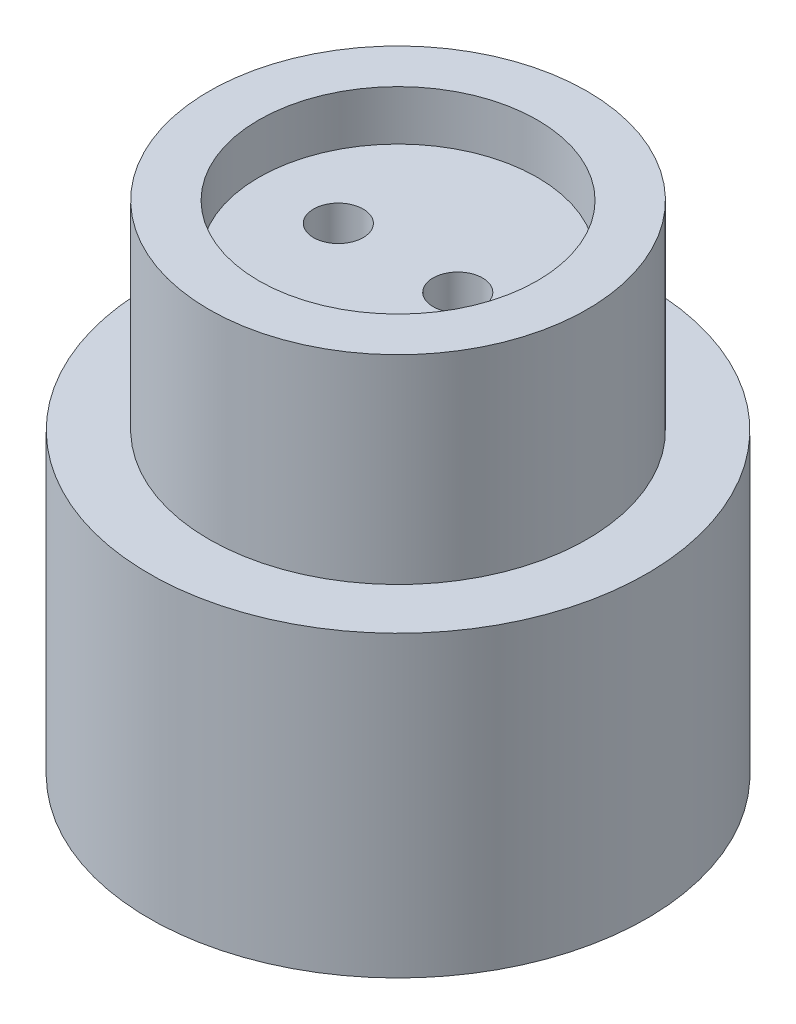
ISO-10303-21;
HEADER;
FILE_DESCRIPTION(('STEP AP214'),'2;1');
FILE_NAME('part.step','',(''),(''),'','','');
FILE_SCHEMA(('AUTOMOTIVE_DESIGN { 1 0 10303 214 1 1 1 1 }'));
ENDSEC;
DATA;
#1=APPLICATION_CONTEXT('core data for automotive mechanical design processes');
#2=APPLICATION_PROTOCOL_DEFINITION('international standard','automotive_design',2000,#1);
#3=PRODUCT_CONTEXT('',#1,'mechanical');
#4=PRODUCT('Part','Part','',(#3));
#5=PRODUCT_RELATED_PRODUCT_CATEGORY('part','',(#4));
#6=PRODUCT_DEFINITION_FORMATION('','',#4);
#7=PRODUCT_DEFINITION_CONTEXT('part definition',#1,'design');
#8=PRODUCT_DEFINITION('design','',#6,#7);
#9=PRODUCT_DEFINITION_SHAPE('','',#8);
#10=(LENGTH_UNIT() NAMED_UNIT(*) SI_UNIT(.MILLI.,.METRE.));
#11=(NAMED_UNIT(*) PLANE_ANGLE_UNIT() SI_UNIT($,.RADIAN.));
#12=(NAMED_UNIT(*) SI_UNIT($,.STERADIAN.) SOLID_ANGLE_UNIT());
#13=UNCERTAINTY_MEASURE_WITH_UNIT(LENGTH_MEASURE(1.E-05),#10,'distance_accuracy_value','');
#14=(GEOMETRIC_REPRESENTATION_CONTEXT(3) GLOBAL_UNCERTAINTY_ASSIGNED_CONTEXT((#13)) GLOBAL_UNIT_ASSIGNED_CONTEXT((#10,
#11,#12)) REPRESENTATION_CONTEXT('',''));
#15=CARTESIAN_POINT('',(0.,0.,0.));
#16=DIRECTION('',(0.,0.,1.));
#17=DIRECTION('',(1.,0.,0.));
#18=AXIS2_PLACEMENT_3D('',#15,#16,#17);
#19=CARTESIAN_POINT('',(1.3,2.64854185998995,0.));
#20=DIRECTION('',(0.,-1.,0.));
#21=DIRECTION('',(1.,0.,0.));
#22=AXIS2_PLACEMENT_3D('',#19,#20,#21);
#23=CYLINDRICAL_SURFACE('',#22,0.249337209086342);
#24=CARTESIAN_POINT('',(1.3,2.,0.));
#25=DIRECTION('',(0.707106781186548,-0.707106781186547,0.));
#26=DIRECTION('',(0.707106781186547,0.707106781186548,0.));
#27=AXIS2_PLACEMENT_3D('',#24,#25,#26);
#28=ELLIPSE('',#27,0.352616062694161,0.249337209086342);
#29=CARTESIAN_POINT('',(1.54933720908634,2.24933720908634,0.));
#30=VERTEX_POINT('',#29);
#31=EDGE_CURVE('E90',#30,#30,#28,.F.);
#32=ORIENTED_EDGE('',*,*,#31,.T.);
#33=EDGE_LOOP('',(#32));
#34=FACE_BOUND('',#33,.T.);
#35=CARTESIAN_POINT('',(1.3,0.,0.));
#36=DIRECTION('',(0.,-1.,0.));
#37=DIRECTION('',(0.,0.,-1.));
#38=AXIS2_PLACEMENT_3D('',#35,#36,#37);
#39=CIRCLE('',#38,0.249337209086342);
#40=CARTESIAN_POINT('',(1.3,0.,-0.249337209086342));
#41=VERTEX_POINT('',#40);
#42=EDGE_CURVE('E48',#41,#41,#39,.T.);
#43=ORIENTED_EDGE('',*,*,#42,.T.);
#44=EDGE_LOOP('',(#43));
#45=FACE_BOUND('',#44,.T.);
#46=ADVANCED_FACE('F32',(#34,#45),#23,.F.);
#47=CARTESIAN_POINT('',(-0.0485418599899526,2.,0.));
#48=DIRECTION('',(1.,0.,0.));
#49=DIRECTION('',(0.,0.,-1.));
#50=AXIS2_PLACEMENT_3D('',#47,#48,#49);
#51=CYLINDRICAL_SURFACE('',#50,0.249337209086342);
#52=CARTESIAN_POINT('',(0.6,2.,0.));
#53=DIRECTION('',(0.707106781186548,-0.707106781186547,0.));
#54=DIRECTION('',(-0.707106781186547,-0.707106781186548,0.));
#55=AXIS2_PLACEMENT_3D('',#52,#53,#54);
#56=ELLIPSE('',#55,0.352616062694161,0.249337209086342);
#57=CARTESIAN_POINT('',(0.350662790913658,1.75066279091366,0.));
#58=VERTEX_POINT('',#57);
#59=EDGE_CURVE('E85',#58,#58,#56,.F.);
#60=ORIENTED_EDGE('',*,*,#59,.T.);
#61=EDGE_LOOP('',(#60));
#62=FACE_BOUND('',#61,.T.);
#63=ORIENTED_EDGE('',*,*,#31,.F.);
#64=EDGE_LOOP('',(#63));
#65=FACE_BOUND('',#64,.T.);
#66=ADVANCED_FACE('F136',(#62,#65),#51,.F.);
#67=CARTESIAN_POINT('',(0.6,4.5,0.));
#68=DIRECTION('',(0.,-1.,0.));
#69=DIRECTION('',(1.,0.,0.));
#70=AXIS2_PLACEMENT_3D('',#67,#68,#69);
#71=CYLINDRICAL_SURFACE('',#70,0.249337209086342);
#72=ORIENTED_EDGE('',*,*,#59,.F.);
#73=EDGE_LOOP('',(#72));
#74=FACE_BOUND('',#73,.T.);
#75=CARTESIAN_POINT('',(0.6,4.5,0.));
#76=DIRECTION('',(0.,1.,0.));
#77=DIRECTION('',(0.,0.,1.));
#78=AXIS2_PLACEMENT_3D('',#75,#76,#77);
#79=CIRCLE('',#78,0.249337209086342);
#80=CARTESIAN_POINT('',(0.6,4.5,0.249337209086342));
#81=VERTEX_POINT('',#80);
#82=EDGE_CURVE('E52',#81,#81,#79,.T.);
#83=ORIENTED_EDGE('',*,*,#82,.T.);
#84=EDGE_LOOP('',(#83));
#85=FACE_BOUND('',#84,.T.);
#86=ADVANCED_FACE('F142',(#74,#85),#71,.F.);
#87=CARTESIAN_POINT('',(0.,0.,0.));
#88=DIRECTION('',(0.,-1.,0.));
#89=DIRECTION('',(0.,0.,-1.));
#90=AXIS2_PLACEMENT_3D('',#87,#88,#89);
#91=PLANE('',#90);
#92=CARTESIAN_POINT('',(-1.3,0.,0.));
#93=DIRECTION('',(0.,-1.,0.));
#94=DIRECTION('',(0.,0.,-1.));
#95=AXIS2_PLACEMENT_3D('',#92,#93,#94);
#96=CIRCLE('',#95,0.249337209086342);
#97=CARTESIAN_POINT('',(-1.3,0.,-0.249337209086342));
#98=VERTEX_POINT('',#97);
#99=EDGE_CURVE('E36',#98,#98,#96,.F.);
#100=ORIENTED_EDGE('',*,*,#99,.T.);
#101=EDGE_LOOP('',(#100));
#102=FACE_BOUND('',#101,.T.);
#103=ORIENTED_EDGE('',*,*,#42,.F.);
#104=EDGE_LOOP('',(#103));
#105=FACE_BOUND('',#104,.T.);
#106=CARTESIAN_POINT('',(0.,0.,0.));
#107=DIRECTION('',(0.,-1.,0.));
#108=DIRECTION('',(0.,0.,-1.));
#109=AXIS2_PLACEMENT_3D('',#106,#107,#108);
#110=CIRCLE('',#109,2.5);
#111=CARTESIAN_POINT('',(0.,0.,-2.5));
#112=VERTEX_POINT('',#111);
#113=EDGE_CURVE('E58',#112,#112,#110,.T.);
#114=ORIENTED_EDGE('',*,*,#113,.T.);
#115=EDGE_LOOP('',(#114));
#116=FACE_BOUND('',#115,.T.);
#117=ADVANCED_FACE('F34',(#102,#105,#116),#91,.T.);
#118=CARTESIAN_POINT('',(0.,0.,0.));
#119=DIRECTION('',(0.,-1.,0.));
#120=DIRECTION('',(0.,0.,-1.));
#121=AXIS2_PLACEMENT_3D('',#118,#119,#120);
#122=CYLINDRICAL_SURFACE('',#121,2.5);
#123=CARTESIAN_POINT('',(0.,3.,0.));
#124=DIRECTION('',(0.,-1.,0.));
#125=DIRECTION('',(0.,0.,-1.));
#126=AXIS2_PLACEMENT_3D('',#123,#124,#125);
#127=CIRCLE('',#126,2.5);
#128=CARTESIAN_POINT('',(0.,3.,-2.5));
#129=VERTEX_POINT('',#128);
#130=EDGE_CURVE('E61',#129,#129,#127,.T.);
#131=ORIENTED_EDGE('',*,*,#130,.T.);
#132=EDGE_LOOP('',(#131));
#133=FACE_BOUND('',#132,.T.);
#134=ORIENTED_EDGE('',*,*,#113,.F.);
#135=EDGE_LOOP('',(#134));
#136=FACE_BOUND('',#135,.T.);
#137=ADVANCED_FACE('F195',(#133,#136),#122,.T.);
#138=CARTESIAN_POINT('',(0.,3.,-2.5));
#139=DIRECTION('',(0.,1.,0.));
#140=DIRECTION('',(0.,0.,1.));
#141=AXIS2_PLACEMENT_3D('',#138,#139,#140);
#142=PLANE('',#141);
#143=CARTESIAN_POINT('',(0.,3.,0.));
#144=DIRECTION('',(0.,-1.,0.));
#145=DIRECTION('',(0.,0.,-1.));
#146=AXIS2_PLACEMENT_3D('',#143,#144,#145);
#147=CIRCLE('',#146,1.9);
#148=CARTESIAN_POINT('',(0.,3.,-1.9));
#149=VERTEX_POINT('',#148);
#150=EDGE_CURVE('E64',#149,#149,#147,.T.);
#151=ORIENTED_EDGE('',*,*,#150,.T.);
#152=EDGE_LOOP('',(#151));
#153=FACE_BOUND('',#152,.T.);
#154=ORIENTED_EDGE('',*,*,#130,.F.);
#155=EDGE_LOOP('',(#154));
#156=FACE_BOUND('',#155,.T.);
#157=ADVANCED_FACE('F192',(#153,#156),#142,.T.);
#158=CARTESIAN_POINT('',(0.,0.,0.));
#159=DIRECTION('',(0.,-1.,0.));
#160=DIRECTION('',(0.,0.,-1.));
#161=AXIS2_PLACEMENT_3D('',#158,#159,#160);
#162=CYLINDRICAL_SURFACE('',#161,1.9);
#163=CARTESIAN_POINT('',(0.,5.,0.));
#164=DIRECTION('',(0.,-1.,0.));
#165=DIRECTION('',(0.,0.,-1.));
#166=AXIS2_PLACEMENT_3D('',#163,#164,#165);
#167=CIRCLE('',#166,1.9);
#168=CARTESIAN_POINT('',(0.,5.,-1.9));
#169=VERTEX_POINT('',#168);
#170=EDGE_CURVE('E67',#169,#169,#167,.T.);
#171=ORIENTED_EDGE('',*,*,#170,.T.);
#172=EDGE_LOOP('',(#171));
#173=FACE_BOUND('',#172,.T.);
#174=ORIENTED_EDGE('',*,*,#150,.F.);
#175=EDGE_LOOP('',(#174));
#176=FACE_BOUND('',#175,.T.);
#177=ADVANCED_FACE('F188',(#173,#176),#162,.T.);
#178=CARTESIAN_POINT('',(0.,5.,-1.4));
#179=DIRECTION('',(0.,1.,0.));
#180=DIRECTION('',(0.,0.,1.));
#181=AXIS2_PLACEMENT_3D('',#178,#179,#180);
#182=PLANE('',#181);
#183=CARTESIAN_POINT('',(0.,5.,0.));
#184=DIRECTION('',(0.,-1.,0.));
#185=DIRECTION('',(0.,0.,-1.));
#186=AXIS2_PLACEMENT_3D('',#183,#184,#185);
#187=CIRCLE('',#186,1.4);
#188=CARTESIAN_POINT('',(0.,5.,-1.4));
#189=VERTEX_POINT('',#188);
#190=EDGE_CURVE('E70',#189,#189,#187,.T.);
#191=ORIENTED_EDGE('',*,*,#190,.T.);
#192=EDGE_LOOP('',(#191));
#193=FACE_BOUND('',#192,.T.);
#194=ORIENTED_EDGE('',*,*,#170,.F.);
#195=EDGE_LOOP('',(#194));
#196=FACE_BOUND('',#195,.T.);
#197=ADVANCED_FACE('F184',(#193,#196),#182,.T.);
#198=CARTESIAN_POINT('',(0.,0.,0.));
#199=DIRECTION('',(0.,-1.,0.));
#200=DIRECTION('',(0.,0.,-1.));
#201=AXIS2_PLACEMENT_3D('',#198,#199,#200);
#202=CYLINDRICAL_SURFACE('',#201,1.4);
#203=CARTESIAN_POINT('',(0.,4.5,0.));
#204=DIRECTION('',(0.,1.,0.));
#205=DIRECTION('',(0.,0.,1.));
#206=AXIS2_PLACEMENT_3D('',#203,#204,#205);
#207=CIRCLE('',#206,1.4);
#208=CARTESIAN_POINT('',(0.,4.5,1.4));
#209=VERTEX_POINT('',#208);
#210=EDGE_CURVE('E55',#209,#209,#207,.T.);
#211=ORIENTED_EDGE('',*,*,#210,.F.);
#212=EDGE_LOOP('',(#211));
#213=FACE_BOUND('',#212,.T.);
#214=ORIENTED_EDGE('',*,*,#190,.F.);
#215=EDGE_LOOP('',(#214));
#216=FACE_BOUND('',#215,.T.);
#217=ADVANCED_FACE('F170',(#213,#216),#202,.F.);
#218=CARTESIAN_POINT('',(0.,4.5,0.));
#219=DIRECTION('',(0.,1.,0.));
#220=DIRECTION('',(0.,0.,1.));
#221=AXIS2_PLACEMENT_3D('',#218,#219,#220);
#222=PLANE('',#221);
#223=CARTESIAN_POINT('',(-0.6,4.5,0.));
#224=DIRECTION('',(0.,-1.,0.));
#225=DIRECTION('',(0.,0.,1.));
#226=AXIS2_PLACEMENT_3D('',#223,#224,#225);
#227=CIRCLE('',#226,0.249337209086342);
#228=CARTESIAN_POINT('',(-0.6,4.5,0.249337209086342));
#229=VERTEX_POINT('',#228);
#230=EDGE_CURVE('E113',#229,#229,#227,.T.);
#231=ORIENTED_EDGE('',*,*,#230,.T.);
#232=EDGE_LOOP('',(#231));
#233=FACE_BOUND('',#232,.T.);
#234=ORIENTED_EDGE('',*,*,#210,.T.);
#235=EDGE_LOOP('',(#234));
#236=FACE_BOUND('',#235,.T.);
#237=ORIENTED_EDGE('',*,*,#82,.F.);
#238=EDGE_LOOP('',(#237));
#239=FACE_BOUND('',#238,.T.);
#240=ADVANCED_FACE('F167',(#233,#236,#239),#222,.T.);
#241=CARTESIAN_POINT('',(-0.6,4.5,0.));
#242=DIRECTION('',(0.,-1.,0.));
#243=DIRECTION('',(1.,0.,0.));
#244=AXIS2_PLACEMENT_3D('',#241,#242,#243);
#245=CYLINDRICAL_SURFACE('',#244,0.249337209086342);
#246=CARTESIAN_POINT('',(-0.6,2.,0.));
#247=DIRECTION('',(-0.707106781186548,-0.707106781186547,0.));
#248=DIRECTION('',(0.707106781186547,-0.707106781186548,0.));
#249=AXIS2_PLACEMENT_3D('',#246,#247,#248);
#250=ELLIPSE('',#249,0.352616062694161,0.249337209086342);
#251=CARTESIAN_POINT('',(-0.350662790913658,1.75066279091366,0.));
#252=VERTEX_POINT('',#251);
#253=EDGE_CURVE('E98',#252,#252,#250,.F.);
#254=ORIENTED_EDGE('',*,*,#253,.F.);
#255=EDGE_LOOP('',(#254));
#256=FACE_BOUND('',#255,.T.);
#257=ORIENTED_EDGE('',*,*,#230,.F.);
#258=EDGE_LOOP('',(#257));
#259=FACE_BOUND('',#258,.T.);
#260=ADVANCED_FACE('F131',(#256,#259),#245,.F.);
#261=CARTESIAN_POINT('',(0.0485418599899526,2.,0.));
#262=DIRECTION('',(-1.,0.,0.));
#263=DIRECTION('',(0.,0.,1.));
#264=AXIS2_PLACEMENT_3D('',#261,#262,#263);
#265=CYLINDRICAL_SURFACE('',#264,0.249337209086342);
#266=ORIENTED_EDGE('',*,*,#253,.T.);
#267=EDGE_LOOP('',(#266));
#268=FACE_BOUND('',#267,.T.);
#269=CARTESIAN_POINT('',(-1.3,2.,0.));
#270=DIRECTION('',(-0.707106781186548,-0.707106781186547,0.));
#271=DIRECTION('',(-0.707106781186547,0.707106781186548,0.));
#272=AXIS2_PLACEMENT_3D('',#269,#270,#271);
#273=ELLIPSE('',#272,0.352616062694161,0.249337209086342);
#274=CARTESIAN_POINT('',(-1.54933720908634,2.24933720908634,0.));
#275=VERTEX_POINT('',#274);
#276=EDGE_CURVE('E108',#275,#275,#273,.F.);
#277=ORIENTED_EDGE('',*,*,#276,.F.);
#278=EDGE_LOOP('',(#277));
#279=FACE_BOUND('',#278,.T.);
#280=ADVANCED_FACE('F124',(#268,#279),#265,.F.);
#281=CARTESIAN_POINT('',(-1.3,2.64854185998995,0.));
#282=DIRECTION('',(0.,-1.,0.));
#283=DIRECTION('',(1.,0.,0.));
#284=AXIS2_PLACEMENT_3D('',#281,#282,#283);
#285=CYLINDRICAL_SURFACE('',#284,0.249337209086342);
#286=ORIENTED_EDGE('',*,*,#276,.T.);
#287=EDGE_LOOP('',(#286));
#288=FACE_BOUND('',#287,.T.);
#289=ORIENTED_EDGE('',*,*,#99,.F.);
#290=EDGE_LOOP('',(#289));
#291=FACE_BOUND('',#290,.T.);
#292=ADVANCED_FACE('F122',(#288,#291),#285,.F.);
#293=CLOSED_SHELL('',(#46,#66,#86,#117,#137,#157,#177,#197,#217,#240,#260,#280,#292));
#294=CARTESIAN_POINT('',(0.,4.2,0.));
#295=DIRECTION('',(0.,1.,0.));
#296=DIRECTION('',(0.,0.,1.));
#297=AXIS2_PLACEMENT_3D('',#294,#295,#296);
#298=PLANE('',#297);
#299=CARTESIAN_POINT('',(0.6,4.2,0.));
#300=DIRECTION('',(0.,1.,0.));
#301=DIRECTION('',(0.,0.,1.));
#302=AXIS2_PLACEMENT_3D('',#299,#300,#301);
#303=CIRCLE('',#302,0.349337209086342);
#304=CARTESIAN_POINT('',(0.6,4.2,0.349337209086342));
#305=VERTEX_POINT('',#304);
#306=EDGE_CURVE('E45',#305,#305,#303,.F.);
#307=ORIENTED_EDGE('',*,*,#306,.F.);
#308=EDGE_LOOP('',(#307));
#309=FACE_BOUND('',#308,.T.);
#310=CARTESIAN_POINT('',(0.,4.2,0.));
#311=DIRECTION('',(0.,1.,0.));
#312=DIRECTION('',(0.,0.,1.));
#313=AXIS2_PLACEMENT_3D('',#310,#311,#312);
#314=CIRCLE('',#313,1.4);
#315=CARTESIAN_POINT('',(0.,4.2,1.4));
#316=VERTEX_POINT('',#315);
#317=EDGE_CURVE('E82',#316,#316,#314,.T.);
#318=ORIENTED_EDGE('',*,*,#317,.F.);
#319=EDGE_LOOP('',(#318));
#320=FACE_BOUND('',#319,.T.);
#321=CARTESIAN_POINT('',(-0.6,4.2,0.));
#322=DIRECTION('',(0.,1.,0.));
#323=DIRECTION('',(0.,0.,1.));
#324=AXIS2_PLACEMENT_3D('',#321,#322,#323);
#325=CIRCLE('',#324,0.349337209086342);
#326=CARTESIAN_POINT('',(-0.6,4.2,0.349337209086342));
#327=VERTEX_POINT('',#326);
#328=EDGE_CURVE('E10',#327,#327,#325,.F.);
#329=ORIENTED_EDGE('',*,*,#328,.F.);
#330=EDGE_LOOP('',(#329));
#331=FACE_BOUND('',#330,.T.);
#332=ADVANCED_FACE('F163',(#309,#320,#331),#298,.F.);
#333=CARTESIAN_POINT('',(0.,0.5,0.));
#334=DIRECTION('',(0.,1.,0.));
#335=DIRECTION('',(0.,0.,1.));
#336=AXIS2_PLACEMENT_3D('',#333,#334,#335);
#337=PLANE('',#336);
#338=CARTESIAN_POINT('',(0.,0.5,0.));
#339=DIRECTION('',(0.,-1.,0.));
#340=DIRECTION('',(0.,0.,-1.));
#341=AXIS2_PLACEMENT_3D('',#338,#339,#340);
#342=CIRCLE('',#341,2.);
#343=CARTESIAN_POINT('',(0.,0.5,-2.));
#344=VERTEX_POINT('',#343);
#345=EDGE_CURVE('E79',#344,#344,#342,.T.);
#346=ORIENTED_EDGE('',*,*,#345,.F.);
#347=EDGE_LOOP('',(#346));
#348=FACE_BOUND('',#347,.T.);
#349=CARTESIAN_POINT('',(1.3,0.499999999999999,0.));
#350=DIRECTION('',(0.,1.,0.));
#351=DIRECTION('',(0.,0.,1.));
#352=AXIS2_PLACEMENT_3D('',#349,#350,#351);
#353=CIRCLE('',#352,0.349337209086342);
#354=CARTESIAN_POINT('',(1.3,0.499999999999999,0.349337209086342));
#355=VERTEX_POINT('',#354);
#356=EDGE_CURVE('E41',#355,#355,#353,.T.);
#357=ORIENTED_EDGE('',*,*,#356,.F.);
#358=EDGE_LOOP('',(#357));
#359=FACE_BOUND('',#358,.T.);
#360=CARTESIAN_POINT('',(-1.3,0.499999999999999,0.));
#361=DIRECTION('',(0.,-1.,0.));
#362=DIRECTION('',(0.,0.,1.));
#363=AXIS2_PLACEMENT_3D('',#360,#361,#362);
#364=CIRCLE('',#363,0.349337209086342);
#365=CARTESIAN_POINT('',(-1.3,0.499999999999999,0.349337209086342));
#366=VERTEX_POINT('',#365);
#367=EDGE_CURVE('E105',#366,#366,#364,.T.);
#368=ORIENTED_EDGE('',*,*,#367,.T.);
#369=EDGE_LOOP('',(#368));
#370=FACE_BOUND('',#369,.T.);
#371=ADVANCED_FACE('F165',(#348,#359,#370),#337,.T.);
#372=CARTESIAN_POINT('',(0.,0.,0.));
#373=DIRECTION('',(0.,-1.,0.));
#374=DIRECTION('',(0.,0.,-1.));
#375=AXIS2_PLACEMENT_3D('',#372,#373,#374);
#376=CYLINDRICAL_SURFACE('',#375,2.);
#377=ORIENTED_EDGE('',*,*,#345,.T.);
#378=EDGE_LOOP('',(#377));
#379=FACE_BOUND('',#378,.T.);
#380=CARTESIAN_POINT('',(0.,2.5,0.));
#381=DIRECTION('',(0.,-1.,0.));
#382=DIRECTION('',(0.,0.,-1.));
#383=AXIS2_PLACEMENT_3D('',#380,#381,#382);
#384=CIRCLE('',#383,2.);
#385=CARTESIAN_POINT('',(0.,2.5,-2.));
#386=VERTEX_POINT('',#385);
#387=EDGE_CURVE('E76',#386,#386,#384,.T.);
#388=ORIENTED_EDGE('',*,*,#387,.F.);
#389=EDGE_LOOP('',(#388));
#390=FACE_BOUND('',#389,.T.);
#391=ADVANCED_FACE('F173',(#379,#390),#376,.F.);
#392=CARTESIAN_POINT('',(0.,2.5,-2.));
#393=DIRECTION('',(0.,-1.,0.));
#394=DIRECTION('',(0.,0.,-1.));
#395=AXIS2_PLACEMENT_3D('',#392,#393,#394);
#396=PLANE('',#395);
#397=ORIENTED_EDGE('',*,*,#387,.T.);
#398=EDGE_LOOP('',(#397));
#399=FACE_BOUND('',#398,.T.);
#400=CARTESIAN_POINT('',(0.,2.5,0.));
#401=DIRECTION('',(0.,-1.,0.));
#402=DIRECTION('',(0.,0.,-1.));
#403=AXIS2_PLACEMENT_3D('',#400,#401,#402);
#404=CIRCLE('',#403,1.4);
#405=CARTESIAN_POINT('',(0.,2.5,-1.4));
#406=VERTEX_POINT('',#405);
#407=EDGE_CURVE('E73',#406,#406,#404,.T.);
#408=ORIENTED_EDGE('',*,*,#407,.F.);
#409=EDGE_LOOP('',(#408));
#410=FACE_BOUND('',#409,.T.);
#411=ADVANCED_FACE('F177',(#399,#410),#396,.T.);
#412=ORIENTED_EDGE('',*,*,#407,.T.);
#413=EDGE_LOOP('',(#412));
#414=FACE_BOUND('',#413,.T.);
#415=ORIENTED_EDGE('',*,*,#317,.T.);
#416=EDGE_LOOP('',(#415));
#417=FACE_BOUND('',#416,.T.);
#418=ADVANCED_FACE('F152',(#414,#417),#202,.F.);
#419=CARTESIAN_POINT('',(0.6,4.5,0.));
#420=DIRECTION('',(0.,-1.,0.));
#421=DIRECTION('',(1.,0.,0.));
#422=AXIS2_PLACEMENT_3D('',#419,#420,#421);
#423=CYLINDRICAL_SURFACE('',#422,0.349337209086342);
#424=CARTESIAN_POINT('',(0.6,2.,0.));
#425=DIRECTION('',(0.707106781186547,-0.707106781186547,0.));
#426=DIRECTION('',(-0.707106781186548,-0.707106781186548,0.));
#427=AXIS2_PLACEMENT_3D('',#424,#425,#426);
#428=ELLIPSE('',#427,0.494037418931471,0.349337209086342);
#429=CARTESIAN_POINT('',(0.250662790913658,1.65066279091366,0.));
#430=VERTEX_POINT('',#429);
#431=EDGE_CURVE('E88',#430,#430,#428,.T.);
#432=ORIENTED_EDGE('',*,*,#431,.F.);
#433=EDGE_LOOP('',(#432));
#434=FACE_BOUND('',#433,.T.);
#435=ORIENTED_EDGE('',*,*,#306,.T.);
#436=EDGE_LOOP('',(#435));
#437=FACE_BOUND('',#436,.T.);
#438=ADVANCED_FACE('F148',(#434,#437),#423,.T.);
#439=CARTESIAN_POINT('',(1.3,2.86854185998995,0.));
#440=DIRECTION('',(0.,-1.,0.));
#441=DIRECTION('',(1.,0.,0.));
#442=AXIS2_PLACEMENT_3D('',#439,#440,#441);
#443=CYLINDRICAL_SURFACE('',#442,0.349337209086342);
#444=CARTESIAN_POINT('',(1.3,2.,0.));
#445=DIRECTION('',(0.707106781186548,-0.707106781186547,0.));
#446=DIRECTION('',(0.707106781186547,0.707106781186548,0.));
#447=AXIS2_PLACEMENT_3D('',#444,#445,#446);
#448=ELLIPSE('',#447,0.494037418931471,0.349337209086342);
#449=CARTESIAN_POINT('',(1.64933720908634,2.34933720908634,0.));
#450=VERTEX_POINT('',#449);
#451=EDGE_CURVE('E51',#450,#450,#448,.T.);
#452=ORIENTED_EDGE('',*,*,#451,.T.);
#453=EDGE_LOOP('',(#452));
#454=FACE_BOUND('',#453,.T.);
#455=ORIENTED_EDGE('',*,*,#356,.T.);
#456=EDGE_LOOP('',(#455));
#457=FACE_BOUND('',#456,.T.);
#458=ADVANCED_FACE('F151',(#454,#457),#443,.T.);
#459=CARTESIAN_POINT('',(-0.268541859989952,2.,0.));
#460=DIRECTION('',(1.,0.,0.));
#461=DIRECTION('',(0.,0.,-1.));
#462=AXIS2_PLACEMENT_3D('',#459,#460,#461);
#463=CYLINDRICAL_SURFACE('',#462,0.349337209086342);
#464=ORIENTED_EDGE('',*,*,#431,.T.);
#465=EDGE_LOOP('',(#464));
#466=FACE_BOUND('',#465,.T.);
#467=ORIENTED_EDGE('',*,*,#451,.F.);
#468=EDGE_LOOP('',(#467));
#469=FACE_BOUND('',#468,.T.);
#470=ADVANCED_FACE('F154',(#466,#469),#463,.T.);
#471=CARTESIAN_POINT('',(-0.6,4.5,0.));
#472=DIRECTION('',(0.,-1.,0.));
#473=DIRECTION('',(1.,0.,0.));
#474=AXIS2_PLACEMENT_3D('',#471,#472,#473);
#475=CYLINDRICAL_SURFACE('',#474,0.349337209086342);
#476=CARTESIAN_POINT('',(-0.6,2.,0.));
#477=DIRECTION('',(-0.707106781186547,-0.707106781186547,0.));
#478=DIRECTION('',(0.707106781186548,-0.707106781186548,0.));
#479=AXIS2_PLACEMENT_3D('',#476,#477,#478);
#480=ELLIPSE('',#479,0.494037418931471,0.349337209086342);
#481=CARTESIAN_POINT('',(-0.250662790913658,1.65066279091366,0.));
#482=VERTEX_POINT('',#481);
#483=EDGE_CURVE('E102',#482,#482,#480,.T.);
#484=ORIENTED_EDGE('',*,*,#483,.F.);
#485=EDGE_LOOP('',(#484));
#486=FACE_BOUND('',#485,.T.);
#487=ORIENTED_EDGE('',*,*,#328,.T.);
#488=EDGE_LOOP('',(#487));
#489=FACE_BOUND('',#488,.T.);
#490=ADVANCED_FACE('F158',(#486,#489),#475,.T.);
#491=CARTESIAN_POINT('',(-1.3,2.86854185998995,0.));
#492=DIRECTION('',(0.,-1.,0.));
#493=DIRECTION('',(1.,0.,0.));
#494=AXIS2_PLACEMENT_3D('',#491,#492,#493);
#495=CYLINDRICAL_SURFACE('',#494,0.349337209086342);
#496=CARTESIAN_POINT('',(-1.3,2.,0.));
#497=DIRECTION('',(-0.707106781186548,-0.707106781186547,0.));
#498=DIRECTION('',(-0.707106781186547,0.707106781186548,0.));
#499=AXIS2_PLACEMENT_3D('',#496,#497,#498);
#500=ELLIPSE('',#499,0.494037418931471,0.349337209086342);
#501=CARTESIAN_POINT('',(-1.64933720908634,2.34933720908634,0.));
#502=VERTEX_POINT('',#501);
#503=EDGE_CURVE('E99',#502,#502,#500,.T.);
#504=ORIENTED_EDGE('',*,*,#503,.T.);
#505=EDGE_LOOP('',(#504));
#506=FACE_BOUND('',#505,.T.);
#507=ORIENTED_EDGE('',*,*,#367,.F.);
#508=EDGE_LOOP('',(#507));
#509=FACE_BOUND('',#508,.T.);
#510=ADVANCED_FACE('F216',(#506,#509),#495,.T.);
#511=CARTESIAN_POINT('',(0.268541859989952,2.,0.));
#512=DIRECTION('',(-1.,0.,0.));
#513=DIRECTION('',(0.,0.,1.));
#514=AXIS2_PLACEMENT_3D('',#511,#512,#513);
#515=CYLINDRICAL_SURFACE('',#514,0.349337209086342);
#516=ORIENTED_EDGE('',*,*,#483,.T.);
#517=EDGE_LOOP('',(#516));
#518=FACE_BOUND('',#517,.T.);
#519=ORIENTED_EDGE('',*,*,#503,.F.);
#520=EDGE_LOOP('',(#519));
#521=FACE_BOUND('',#520,.T.);
#522=ADVANCED_FACE('F219',(#518,#521),#515,.T.);
#523=CLOSED_SHELL('',(#332,#371,#391,#411,#418,#438,#458,#470,#490,#510,#522));
#524=ORIENTED_CLOSED_SHELL('',*,#523,.T.);
#525=BREP_WITH_VOIDS('B2',#293,(#524));
#526=ADVANCED_BREP_SHAPE_REPRESENTATION('',(#18,#525),#14);
#527=SHAPE_DEFINITION_REPRESENTATION(#9,#526);
ENDSEC;
END-ISO-10303-21;
